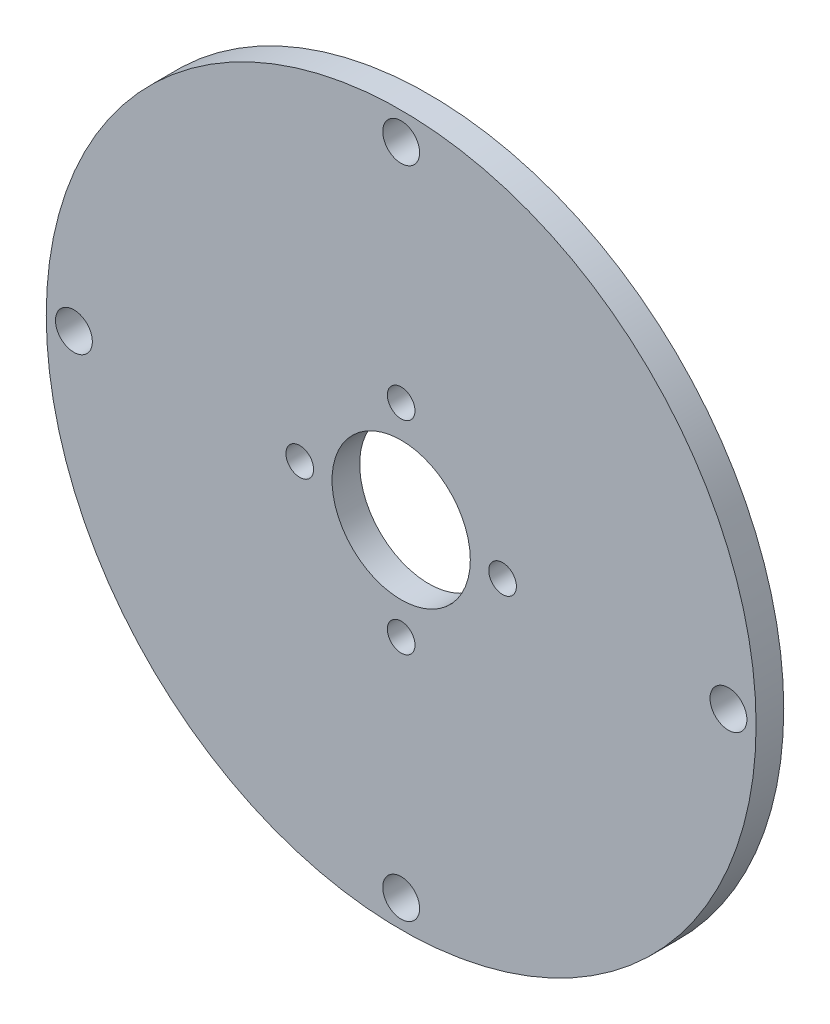
ISO-10303-21;
HEADER;
FILE_DESCRIPTION(('STEP AP214'),'2;1');
FILE_NAME('part.step','',(''),(''),'','','');
FILE_SCHEMA(('AUTOMOTIVE_DESIGN { 1 0 10303 214 1 1 1 1 }'));
ENDSEC;
DATA;
#1=APPLICATION_CONTEXT('core data for automotive mechanical design processes');
#2=APPLICATION_PROTOCOL_DEFINITION('international standard','automotive_design',2000,#1);
#3=PRODUCT_CONTEXT('',#1,'mechanical');
#4=PRODUCT('Part','Part','',(#3));
#5=PRODUCT_RELATED_PRODUCT_CATEGORY('part','',(#4));
#6=PRODUCT_DEFINITION_FORMATION('','',#4);
#7=PRODUCT_DEFINITION_CONTEXT('part definition',#1,'design');
#8=PRODUCT_DEFINITION('design','',#6,#7);
#9=PRODUCT_DEFINITION_SHAPE('','',#8);
#10=(LENGTH_UNIT() NAMED_UNIT(*) SI_UNIT(.MILLI.,.METRE.));
#11=(NAMED_UNIT(*) PLANE_ANGLE_UNIT() SI_UNIT($,.RADIAN.));
#12=(NAMED_UNIT(*) SI_UNIT($,.STERADIAN.) SOLID_ANGLE_UNIT());
#13=UNCERTAINTY_MEASURE_WITH_UNIT(LENGTH_MEASURE(1.E-05),#10,'distance_accuracy_value','');
#14=(GEOMETRIC_REPRESENTATION_CONTEXT(3) GLOBAL_UNCERTAINTY_ASSIGNED_CONTEXT((#13)) GLOBAL_UNIT_ASSIGNED_CONTEXT((#10,
#11,#12)) REPRESENTATION_CONTEXT('',''));
#15=CARTESIAN_POINT('',(0.,0.,0.));
#16=DIRECTION('',(0.,0.,1.));
#17=DIRECTION('',(1.,0.,0.));
#18=AXIS2_PLACEMENT_3D('',#15,#16,#17);
#19=CARTESIAN_POINT('',(0.,0.,3.));
#20=DIRECTION('',(0.,0.,1.));
#21=DIRECTION('',(1.,0.,0.));
#22=AXIS2_PLACEMENT_3D('',#19,#20,#21);
#23=PLANE('',#22);
#24=CARTESIAN_POINT('',(-10.9999999999994,-6.23256940250295E-13,3.));
#25=DIRECTION('',(0.,0.,1.));
#26=DIRECTION('',(1.,0.,0.));
#27=AXIS2_PLACEMENT_3D('',#24,#25,#26);
#28=CIRCLE('',#27,1.5);
#29=CARTESIAN_POINT('',(-9.49999999999938,-6.23256940250295E-13,3.));
#30=VERTEX_POINT('',#29);
#31=EDGE_CURVE('E83',#30,#30,#28,.T.);
#32=ORIENTED_EDGE('',*,*,#31,.F.);
#33=EDGE_LOOP('',(#32));
#34=FACE_BOUND('',#33,.T.);
#35=CARTESIAN_POINT('',(1.24381965754247E-12,-11.,3.));
#36=DIRECTION('',(0.,0.,1.));
#37=DIRECTION('',(1.,0.,0.));
#38=AXIS2_PLACEMENT_3D('',#35,#36,#37);
#39=CIRCLE('',#38,1.5);
#40=CARTESIAN_POINT('',(1.50000000000124,-11.,3.));
#41=VERTEX_POINT('',#40);
#42=EDGE_CURVE('E71',#41,#41,#39,.T.);
#43=ORIENTED_EDGE('',*,*,#42,.F.);
#44=EDGE_LOOP('',(#43));
#45=FACE_BOUND('',#44,.T.);
#46=CARTESIAN_POINT('',(11.0000000000006,6.21909828771233E-13,3.));
#47=DIRECTION('',(0.,0.,1.));
#48=DIRECTION('',(1.,0.,0.));
#49=AXIS2_PLACEMENT_3D('',#46,#47,#48);
#50=CIRCLE('',#49,1.5);
#51=CARTESIAN_POINT('',(12.5000000000006,6.21909828771233E-13,3.));
#52=VERTEX_POINT('',#51);
#53=EDGE_CURVE('E59',#52,#52,#50,.T.);
#54=ORIENTED_EDGE('',*,*,#53,.F.);
#55=EDGE_LOOP('',(#54));
#56=FACE_BOUND('',#55,.T.);
#57=CARTESIAN_POINT('',(0.,35.5,3.));
#58=DIRECTION('',(0.,0.,1.));
#59=DIRECTION('',(1.,0.,0.));
#60=AXIS2_PLACEMENT_3D('',#57,#58,#59);
#61=CIRCLE('',#60,2.);
#62=CARTESIAN_POINT('',(2.,35.5,3.));
#63=VERTEX_POINT('',#62);
#64=EDGE_CURVE('E47',#63,#63,#61,.T.);
#65=ORIENTED_EDGE('',*,*,#64,.F.);
#66=EDGE_LOOP('',(#65));
#67=FACE_BOUND('',#66,.T.);
#68=CARTESIAN_POINT('',(0.,0.,3.));
#69=DIRECTION('',(0.,0.,1.));
#70=DIRECTION('',(1.,0.,0.));
#71=AXIS2_PLACEMENT_3D('',#68,#69,#70);
#72=CIRCLE('',#71,38.5);
#73=CARTESIAN_POINT('',(38.5,0.,3.));
#74=VERTEX_POINT('',#73);
#75=EDGE_CURVE('E10',#74,#74,#72,.T.);
#76=ORIENTED_EDGE('',*,*,#75,.T.);
#77=EDGE_LOOP('',(#76));
#78=FACE_BOUND('',#77,.T.);
#79=CARTESIAN_POINT('',(0.,11.,3.));
#80=DIRECTION('',(0.,0.,1.));
#81=DIRECTION('',(1.,0.,0.));
#82=AXIS2_PLACEMENT_3D('',#79,#80,#81);
#83=CIRCLE('',#82,1.5);
#84=CARTESIAN_POINT('',(1.5,11.,3.));
#85=VERTEX_POINT('',#84);
#86=EDGE_CURVE('E42',#85,#85,#83,.T.);
#87=ORIENTED_EDGE('',*,*,#86,.F.);
#88=EDGE_LOOP('',(#87));
#89=FACE_BOUND('',#88,.T.);
#90=CARTESIAN_POINT('',(0.,0.,3.));
#91=DIRECTION('',(0.,0.,1.));
#92=DIRECTION('',(1.,0.,0.));
#93=AXIS2_PLACEMENT_3D('',#90,#91,#92);
#94=CIRCLE('',#93,7.5);
#95=CARTESIAN_POINT('',(7.5,0.,3.));
#96=VERTEX_POINT('',#95);
#97=EDGE_CURVE('E53',#96,#96,#94,.T.);
#98=ORIENTED_EDGE('',*,*,#97,.F.);
#99=EDGE_LOOP('',(#98));
#100=FACE_BOUND('',#99,.T.);
#101=CARTESIAN_POINT('',(35.5000000000006,6.23410021100189E-13,3.));
#102=DIRECTION('',(0.,0.,1.));
#103=DIRECTION('',(1.,0.,0.));
#104=AXIS2_PLACEMENT_3D('',#101,#102,#103);
#105=CIRCLE('',#104,2.00000000000054);
#106=CARTESIAN_POINT('',(37.5000000000012,6.23410021100189E-13,3.));
#107=VERTEX_POINT('',#106);
#108=EDGE_CURVE('E65',#107,#107,#105,.T.);
#109=ORIENTED_EDGE('',*,*,#108,.F.);
#110=EDGE_LOOP('',(#109));
#111=FACE_BOUND('',#110,.T.);
#112=CARTESIAN_POINT('',(1.24682004220038E-12,-35.5,3.));
#113=DIRECTION('',(0.,0.,1.));
#114=DIRECTION('',(1.,0.,0.));
#115=AXIS2_PLACEMENT_3D('',#112,#113,#114);
#116=CIRCLE('',#115,2.00000000000143);
#117=CARTESIAN_POINT('',(2.00000000000268,-35.5,3.));
#118=VERTEX_POINT('',#117);
#119=EDGE_CURVE('E77',#118,#118,#116,.T.);
#120=ORIENTED_EDGE('',*,*,#119,.F.);
#121=EDGE_LOOP('',(#120));
#122=FACE_BOUND('',#121,.T.);
#123=CARTESIAN_POINT('',(-35.4999999999994,-6.27757517237162E-13,3.));
#124=DIRECTION('',(0.,0.,1.));
#125=DIRECTION('',(1.,0.,0.));
#126=AXIS2_PLACEMENT_3D('',#123,#124,#125);
#127=CIRCLE('',#126,2.00000000000114);
#128=CARTESIAN_POINT('',(-33.4999999999982,-6.27757517237162E-13,3.));
#129=VERTEX_POINT('',#128);
#130=EDGE_CURVE('E89',#129,#129,#127,.T.);
#131=ORIENTED_EDGE('',*,*,#130,.F.);
#132=EDGE_LOOP('',(#131));
#133=FACE_BOUND('',#132,.T.);
#134=ADVANCED_FACE('F31',(#34,#45,#56,#67,#78,#89,#100,#111,#122,#133),#23,.T.);
#135=CARTESIAN_POINT('',(0.,0.,0.));
#136=DIRECTION('',(0.,0.,1.));
#137=DIRECTION('',(1.,0.,0.));
#138=AXIS2_PLACEMENT_3D('',#135,#136,#137);
#139=PLANE('',#138);
#140=CARTESIAN_POINT('',(0.,0.,0.));
#141=DIRECTION('',(0.,0.,1.));
#142=DIRECTION('',(1.,0.,0.));
#143=AXIS2_PLACEMENT_3D('',#140,#141,#142);
#144=CIRCLE('',#143,38.5);
#145=CARTESIAN_POINT('',(38.5,0.,0.));
#146=VERTEX_POINT('',#145);
#147=EDGE_CURVE('E35',#146,#146,#144,.T.);
#148=ORIENTED_EDGE('',*,*,#147,.F.);
#149=EDGE_LOOP('',(#148));
#150=FACE_BOUND('',#149,.T.);
#151=CARTESIAN_POINT('',(0.,11.,0.));
#152=DIRECTION('',(0.,0.,1.));
#153=DIRECTION('',(1.,0.,0.));
#154=AXIS2_PLACEMENT_3D('',#151,#152,#153);
#155=CIRCLE('',#154,1.5);
#156=CARTESIAN_POINT('',(1.5,11.,0.));
#157=VERTEX_POINT('',#156);
#158=EDGE_CURVE('E44',#157,#157,#155,.T.);
#159=ORIENTED_EDGE('',*,*,#158,.T.);
#160=EDGE_LOOP('',(#159));
#161=FACE_BOUND('',#160,.T.);
#162=CARTESIAN_POINT('',(0.,35.5,0.));
#163=DIRECTION('',(0.,0.,1.));
#164=DIRECTION('',(1.,0.,0.));
#165=AXIS2_PLACEMENT_3D('',#162,#163,#164);
#166=CIRCLE('',#165,2.);
#167=CARTESIAN_POINT('',(2.,35.5,0.));
#168=VERTEX_POINT('',#167);
#169=EDGE_CURVE('E50',#168,#168,#166,.T.);
#170=ORIENTED_EDGE('',*,*,#169,.T.);
#171=EDGE_LOOP('',(#170));
#172=FACE_BOUND('',#171,.T.);
#173=CARTESIAN_POINT('',(0.,0.,0.));
#174=DIRECTION('',(0.,0.,1.));
#175=DIRECTION('',(1.,0.,0.));
#176=AXIS2_PLACEMENT_3D('',#173,#174,#175);
#177=CIRCLE('',#176,7.5);
#178=CARTESIAN_POINT('',(7.5,0.,0.));
#179=VERTEX_POINT('',#178);
#180=EDGE_CURVE('E56',#179,#179,#177,.T.);
#181=ORIENTED_EDGE('',*,*,#180,.T.);
#182=EDGE_LOOP('',(#181));
#183=FACE_BOUND('',#182,.T.);
#184=CARTESIAN_POINT('',(11.0000000000006,6.21909828771233E-13,0.));
#185=DIRECTION('',(0.,0.,1.));
#186=DIRECTION('',(1.,0.,0.));
#187=AXIS2_PLACEMENT_3D('',#184,#185,#186);
#188=CIRCLE('',#187,1.5);
#189=CARTESIAN_POINT('',(12.5000000000006,6.21909828771233E-13,0.));
#190=VERTEX_POINT('',#189);
#191=EDGE_CURVE('E62',#190,#190,#188,.T.);
#192=ORIENTED_EDGE('',*,*,#191,.T.);
#193=EDGE_LOOP('',(#192));
#194=FACE_BOUND('',#193,.T.);
#195=CARTESIAN_POINT('',(35.5000000000006,6.23410021100189E-13,0.));
#196=DIRECTION('',(0.,0.,1.));
#197=DIRECTION('',(1.,0.,0.));
#198=AXIS2_PLACEMENT_3D('',#195,#196,#197);
#199=CIRCLE('',#198,2.00000000000054);
#200=CARTESIAN_POINT('',(37.5000000000012,6.23410021100189E-13,0.));
#201=VERTEX_POINT('',#200);
#202=EDGE_CURVE('E68',#201,#201,#199,.T.);
#203=ORIENTED_EDGE('',*,*,#202,.T.);
#204=EDGE_LOOP('',(#203));
#205=FACE_BOUND('',#204,.T.);
#206=CARTESIAN_POINT('',(1.24381965754247E-12,-11.,0.));
#207=DIRECTION('',(0.,0.,1.));
#208=DIRECTION('',(1.,0.,0.));
#209=AXIS2_PLACEMENT_3D('',#206,#207,#208);
#210=CIRCLE('',#209,1.5);
#211=CARTESIAN_POINT('',(1.50000000000124,-11.,0.));
#212=VERTEX_POINT('',#211);
#213=EDGE_CURVE('E74',#212,#212,#210,.T.);
#214=ORIENTED_EDGE('',*,*,#213,.T.);
#215=EDGE_LOOP('',(#214));
#216=FACE_BOUND('',#215,.T.);
#217=CARTESIAN_POINT('',(1.24682004220038E-12,-35.5,0.));
#218=DIRECTION('',(0.,0.,1.));
#219=DIRECTION('',(1.,0.,0.));
#220=AXIS2_PLACEMENT_3D('',#217,#218,#219);
#221=CIRCLE('',#220,2.00000000000143);
#222=CARTESIAN_POINT('',(2.00000000000268,-35.5,0.));
#223=VERTEX_POINT('',#222);
#224=EDGE_CURVE('E80',#223,#223,#221,.T.);
#225=ORIENTED_EDGE('',*,*,#224,.T.);
#226=EDGE_LOOP('',(#225));
#227=FACE_BOUND('',#226,.T.);
#228=CARTESIAN_POINT('',(-10.9999999999994,-6.23256940250295E-13,0.));
#229=DIRECTION('',(0.,0.,1.));
#230=DIRECTION('',(1.,0.,0.));
#231=AXIS2_PLACEMENT_3D('',#228,#229,#230);
#232=CIRCLE('',#231,1.5);
#233=CARTESIAN_POINT('',(-9.49999999999938,-6.23256940250295E-13,0.));
#234=VERTEX_POINT('',#233);
#235=EDGE_CURVE('E86',#234,#234,#232,.T.);
#236=ORIENTED_EDGE('',*,*,#235,.T.);
#237=EDGE_LOOP('',(#236));
#238=FACE_BOUND('',#237,.T.);
#239=CARTESIAN_POINT('',(-35.4999999999994,-6.27757517237162E-13,0.));
#240=DIRECTION('',(0.,0.,1.));
#241=DIRECTION('',(1.,0.,0.));
#242=AXIS2_PLACEMENT_3D('',#239,#240,#241);
#243=CIRCLE('',#242,2.00000000000114);
#244=CARTESIAN_POINT('',(-33.4999999999982,-6.27757517237162E-13,0.));
#245=VERTEX_POINT('',#244);
#246=EDGE_CURVE('E92',#245,#245,#243,.T.);
#247=ORIENTED_EDGE('',*,*,#246,.T.);
#248=EDGE_LOOP('',(#247));
#249=FACE_BOUND('',#248,.T.);
#250=ADVANCED_FACE('F102',(#150,#161,#172,#183,#194,#205,#216,#227,#238,#249),#139,.F.);
#251=CARTESIAN_POINT('',(0.,0.,3.));
#252=DIRECTION('',(0.,0.,-1.));
#253=DIRECTION('',(-1.,0.,0.));
#254=AXIS2_PLACEMENT_3D('',#251,#252,#253);
#255=CYLINDRICAL_SURFACE('',#254,38.5);
#256=ORIENTED_EDGE('',*,*,#75,.F.);
#257=EDGE_LOOP('',(#256));
#258=FACE_BOUND('',#257,.T.);
#259=ORIENTED_EDGE('',*,*,#147,.T.);
#260=EDGE_LOOP('',(#259));
#261=FACE_BOUND('',#260,.T.);
#262=ADVANCED_FACE('F33',(#258,#261),#255,.T.);
#263=CARTESIAN_POINT('',(0.,11.,3.));
#264=DIRECTION('',(0.,0.,-1.));
#265=DIRECTION('',(-1.,0.,0.));
#266=AXIS2_PLACEMENT_3D('',#263,#264,#265);
#267=CYLINDRICAL_SURFACE('',#266,1.5);
#268=ORIENTED_EDGE('',*,*,#86,.T.);
#269=EDGE_LOOP('',(#268));
#270=FACE_BOUND('',#269,.T.);
#271=ORIENTED_EDGE('',*,*,#158,.F.);
#272=EDGE_LOOP('',(#271));
#273=FACE_BOUND('',#272,.T.);
#274=ADVANCED_FACE('F112',(#270,#273),#267,.F.);
#275=CARTESIAN_POINT('',(0.,35.5,3.));
#276=DIRECTION('',(0.,0.,-1.));
#277=DIRECTION('',(-1.,0.,0.));
#278=AXIS2_PLACEMENT_3D('',#275,#276,#277);
#279=CYLINDRICAL_SURFACE('',#278,2.);
#280=ORIENTED_EDGE('',*,*,#64,.T.);
#281=EDGE_LOOP('',(#280));
#282=FACE_BOUND('',#281,.T.);
#283=ORIENTED_EDGE('',*,*,#169,.F.);
#284=EDGE_LOOP('',(#283));
#285=FACE_BOUND('',#284,.T.);
#286=ADVANCED_FACE('F115',(#282,#285),#279,.F.);
#287=CARTESIAN_POINT('',(0.,0.,3.));
#288=DIRECTION('',(0.,0.,-1.));
#289=DIRECTION('',(-1.,0.,0.));
#290=AXIS2_PLACEMENT_3D('',#287,#288,#289);
#291=CYLINDRICAL_SURFACE('',#290,7.5);
#292=ORIENTED_EDGE('',*,*,#97,.T.);
#293=EDGE_LOOP('',(#292));
#294=FACE_BOUND('',#293,.T.);
#295=ORIENTED_EDGE('',*,*,#180,.F.);
#296=EDGE_LOOP('',(#295));
#297=FACE_BOUND('',#296,.T.);
#298=ADVANCED_FACE('F119',(#294,#297),#291,.F.);
#299=CARTESIAN_POINT('',(11.0000000000006,6.21909828771233E-13,3.));
#300=DIRECTION('',(0.,0.,-1.));
#301=DIRECTION('',(-1.,0.,0.));
#302=AXIS2_PLACEMENT_3D('',#299,#300,#301);
#303=CYLINDRICAL_SURFACE('',#302,1.5);
#304=ORIENTED_EDGE('',*,*,#53,.T.);
#305=EDGE_LOOP('',(#304));
#306=FACE_BOUND('',#305,.T.);
#307=ORIENTED_EDGE('',*,*,#191,.F.);
#308=EDGE_LOOP('',(#307));
#309=FACE_BOUND('',#308,.T.);
#310=ADVANCED_FACE('F123',(#306,#309),#303,.F.);
#311=CARTESIAN_POINT('',(35.5000000000006,6.23410021100189E-13,3.));
#312=DIRECTION('',(0.,0.,-1.));
#313=DIRECTION('',(-1.,0.,0.));
#314=AXIS2_PLACEMENT_3D('',#311,#312,#313);
#315=CYLINDRICAL_SURFACE('',#314,2.00000000000054);
#316=ORIENTED_EDGE('',*,*,#108,.T.);
#317=EDGE_LOOP('',(#316));
#318=FACE_BOUND('',#317,.T.);
#319=ORIENTED_EDGE('',*,*,#202,.F.);
#320=EDGE_LOOP('',(#319));
#321=FACE_BOUND('',#320,.T.);
#322=ADVANCED_FACE('F127',(#318,#321),#315,.F.);
#323=CARTESIAN_POINT('',(1.24381965754247E-12,-11.,3.));
#324=DIRECTION('',(0.,0.,-1.));
#325=DIRECTION('',(-1.,0.,0.));
#326=AXIS2_PLACEMENT_3D('',#323,#324,#325);
#327=CYLINDRICAL_SURFACE('',#326,1.5);
#328=ORIENTED_EDGE('',*,*,#42,.T.);
#329=EDGE_LOOP('',(#328));
#330=FACE_BOUND('',#329,.T.);
#331=ORIENTED_EDGE('',*,*,#213,.F.);
#332=EDGE_LOOP('',(#331));
#333=FACE_BOUND('',#332,.T.);
#334=ADVANCED_FACE('F131',(#330,#333),#327,.F.);
#335=CARTESIAN_POINT('',(1.24682004220038E-12,-35.5,3.));
#336=DIRECTION('',(0.,0.,-1.));
#337=DIRECTION('',(-1.,0.,0.));
#338=AXIS2_PLACEMENT_3D('',#335,#336,#337);
#339=CYLINDRICAL_SURFACE('',#338,2.00000000000143);
#340=ORIENTED_EDGE('',*,*,#119,.T.);
#341=EDGE_LOOP('',(#340));
#342=FACE_BOUND('',#341,.T.);
#343=ORIENTED_EDGE('',*,*,#224,.F.);
#344=EDGE_LOOP('',(#343));
#345=FACE_BOUND('',#344,.T.);
#346=ADVANCED_FACE('F135',(#342,#345),#339,.F.);
#347=CARTESIAN_POINT('',(-10.9999999999994,-6.23256940250295E-13,3.));
#348=DIRECTION('',(0.,0.,-1.));
#349=DIRECTION('',(-1.,0.,0.));
#350=AXIS2_PLACEMENT_3D('',#347,#348,#349);
#351=CYLINDRICAL_SURFACE('',#350,1.5);
#352=ORIENTED_EDGE('',*,*,#31,.T.);
#353=EDGE_LOOP('',(#352));
#354=FACE_BOUND('',#353,.T.);
#355=ORIENTED_EDGE('',*,*,#235,.F.);
#356=EDGE_LOOP('',(#355));
#357=FACE_BOUND('',#356,.T.);
#358=ADVANCED_FACE('F139',(#354,#357),#351,.F.);
#359=CARTESIAN_POINT('',(-35.4999999999994,-6.27757517237162E-13,3.));
#360=DIRECTION('',(0.,0.,-1.));
#361=DIRECTION('',(-1.,0.,0.));
#362=AXIS2_PLACEMENT_3D('',#359,#360,#361);
#363=CYLINDRICAL_SURFACE('',#362,2.00000000000114);
#364=ORIENTED_EDGE('',*,*,#130,.T.);
#365=EDGE_LOOP('',(#364));
#366=FACE_BOUND('',#365,.T.);
#367=ORIENTED_EDGE('',*,*,#246,.F.);
#368=EDGE_LOOP('',(#367));
#369=FACE_BOUND('',#368,.T.);
#370=ADVANCED_FACE('F98',(#366,#369),#363,.F.);
#371=CLOSED_SHELL('',(#134,#250,#262,#274,#286,#298,#310,#322,#334,#346,#358,#370));
#372=MANIFOLD_SOLID_BREP('B2',#371);
#373=ADVANCED_BREP_SHAPE_REPRESENTATION('',(#18,#372),#14);
#374=SHAPE_DEFINITION_REPRESENTATION(#9,#373);
ENDSEC;
END-ISO-10303-21;
